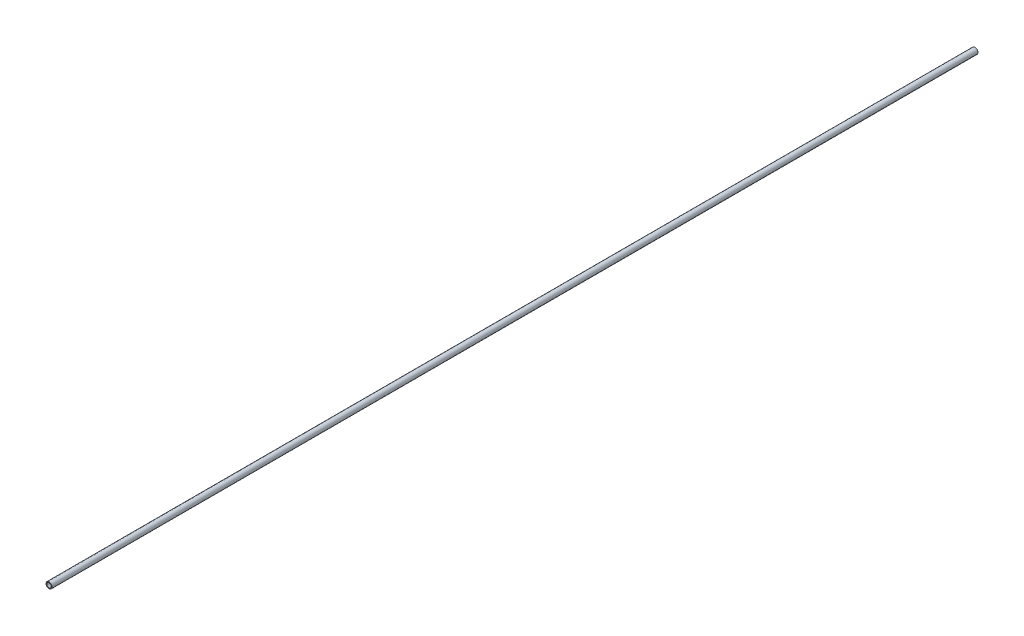
ISO-10303-21;
HEADER;
FILE_DESCRIPTION(('STEP AP214'),'2;1');
FILE_NAME('part.step','',(''),(''),'','','');
FILE_SCHEMA(('AUTOMOTIVE_DESIGN { 1 0 10303 214 1 1 1 1 }'));
ENDSEC;
DATA;
#1=APPLICATION_CONTEXT('core data for automotive mechanical design processes');
#2=APPLICATION_PROTOCOL_DEFINITION('international standard','automotive_design',2000,#1);
#3=PRODUCT_CONTEXT('',#1,'mechanical');
#4=PRODUCT('Part','Part','',(#3));
#5=PRODUCT_RELATED_PRODUCT_CATEGORY('part','',(#4));
#6=PRODUCT_DEFINITION_FORMATION('','',#4);
#7=PRODUCT_DEFINITION_CONTEXT('part definition',#1,'design');
#8=PRODUCT_DEFINITION('design','',#6,#7);
#9=PRODUCT_DEFINITION_SHAPE('','',#8);
#10=(LENGTH_UNIT() NAMED_UNIT(*) SI_UNIT(.MILLI.,.METRE.));
#11=(NAMED_UNIT(*) PLANE_ANGLE_UNIT() SI_UNIT($,.RADIAN.));
#12=(NAMED_UNIT(*) SI_UNIT($,.STERADIAN.) SOLID_ANGLE_UNIT());
#13=UNCERTAINTY_MEASURE_WITH_UNIT(LENGTH_MEASURE(1.E-05),#10,'distance_accuracy_value','');
#14=(GEOMETRIC_REPRESENTATION_CONTEXT(3) GLOBAL_UNCERTAINTY_ASSIGNED_CONTEXT((#13)) GLOBAL_UNIT_ASSIGNED_CONTEXT((#10,
#11,#12)) REPRESENTATION_CONTEXT('',''));
#15=CARTESIAN_POINT('',(0.,0.,0.));
#16=DIRECTION('',(0.,0.,1.));
#17=DIRECTION('',(1.,0.,0.));
#18=AXIS2_PLACEMENT_3D('',#15,#16,#17);
#19=CARTESIAN_POINT('',(0.,0.,1233.));
#20=DIRECTION('',(0.,0.,1.));
#21=DIRECTION('',(1.,0.,0.));
#22=AXIS2_PLACEMENT_3D('',#19,#20,#21);
#23=PLANE('',#22);
#24=CARTESIAN_POINT('',(0.,0.,1233.));
#25=DIRECTION('',(0.,0.,1.));
#26=DIRECTION('',(1.,0.,0.));
#27=AXIS2_PLACEMENT_3D('',#24,#25,#26);
#28=CIRCLE('',#27,4.);
#29=CARTESIAN_POINT('',(4.,0.,1233.));
#30=VERTEX_POINT('',#29);
#31=EDGE_CURVE('E10',#30,#30,#28,.T.);
#32=ORIENTED_EDGE('',*,*,#31,.T.);
#33=EDGE_LOOP('',(#32));
#34=FACE_BOUND('',#33,.T.);
#35=CARTESIAN_POINT('',(0.,0.,1233.));
#36=DIRECTION('',(0.,0.,1.));
#37=DIRECTION('',(1.,0.,0.));
#38=AXIS2_PLACEMENT_3D('',#35,#36,#37);
#39=CIRCLE('',#38,3.);
#40=CARTESIAN_POINT('',(3.,0.,1233.));
#41=VERTEX_POINT('',#40);
#42=EDGE_CURVE('E50',#41,#41,#39,.T.);
#43=ORIENTED_EDGE('',*,*,#42,.F.);
#44=EDGE_LOOP('',(#43));
#45=FACE_BOUND('',#44,.T.);
#46=ADVANCED_FACE('F39',(#34,#45),#23,.T.);
#47=CARTESIAN_POINT('',(0.,0.,0.));
#48=DIRECTION('',(0.,0.,1.));
#49=DIRECTION('',(1.,0.,0.));
#50=AXIS2_PLACEMENT_3D('',#47,#48,#49);
#51=PLANE('',#50);
#52=CARTESIAN_POINT('',(0.,0.,0.));
#53=DIRECTION('',(0.,0.,1.));
#54=DIRECTION('',(1.,0.,0.));
#55=AXIS2_PLACEMENT_3D('',#52,#53,#54);
#56=CIRCLE('',#55,4.);
#57=CARTESIAN_POINT('',(4.,0.,0.));
#58=VERTEX_POINT('',#57);
#59=EDGE_CURVE('E43',#58,#58,#56,.T.);
#60=ORIENTED_EDGE('',*,*,#59,.F.);
#61=EDGE_LOOP('',(#60));
#62=FACE_BOUND('',#61,.T.);
#63=CARTESIAN_POINT('',(0.,0.,0.));
#64=DIRECTION('',(0.,0.,1.));
#65=DIRECTION('',(1.,0.,0.));
#66=AXIS2_PLACEMENT_3D('',#63,#64,#65);
#67=CIRCLE('',#66,3.);
#68=CARTESIAN_POINT('',(3.,0.,0.));
#69=VERTEX_POINT('',#68);
#70=EDGE_CURVE('E52',#69,#69,#67,.T.);
#71=ORIENTED_EDGE('',*,*,#70,.T.);
#72=EDGE_LOOP('',(#71));
#73=FACE_BOUND('',#72,.T.);
#74=ADVANCED_FACE('F62',(#62,#73),#51,.F.);
#75=CARTESIAN_POINT('',(0.,0.,1233.));
#76=DIRECTION('',(0.,0.,-1.));
#77=DIRECTION('',(-1.,0.,0.));
#78=AXIS2_PLACEMENT_3D('',#75,#76,#77);
#79=CYLINDRICAL_SURFACE('',#78,4.);
#80=ORIENTED_EDGE('',*,*,#31,.F.);
#81=EDGE_LOOP('',(#80));
#82=FACE_BOUND('',#81,.T.);
#83=ORIENTED_EDGE('',*,*,#59,.T.);
#84=EDGE_LOOP('',(#83));
#85=FACE_BOUND('',#84,.T.);
#86=ADVANCED_FACE('F41',(#82,#85),#79,.T.);
#87=CARTESIAN_POINT('',(0.,0.,1233.));
#88=DIRECTION('',(0.,0.,-1.));
#89=DIRECTION('',(-1.,0.,0.));
#90=AXIS2_PLACEMENT_3D('',#87,#88,#89);
#91=CYLINDRICAL_SURFACE('',#90,3.);
#92=ORIENTED_EDGE('',*,*,#42,.T.);
#93=EDGE_LOOP('',(#92));
#94=FACE_BOUND('',#93,.T.);
#95=ORIENTED_EDGE('',*,*,#70,.F.);
#96=EDGE_LOOP('',(#95));
#97=FACE_BOUND('',#96,.T.);
#98=ADVANCED_FACE('F58',(#94,#97),#91,.F.);
#99=CLOSED_SHELL('',(#46,#74,#86,#98));
#100=MANIFOLD_SOLID_BREP('B2',#99);
#101=ADVANCED_BREP_SHAPE_REPRESENTATION('',(#18,#100),#14);
#102=SHAPE_DEFINITION_REPRESENTATION(#9,#101);
ENDSEC;
END-ISO-10303-21;
